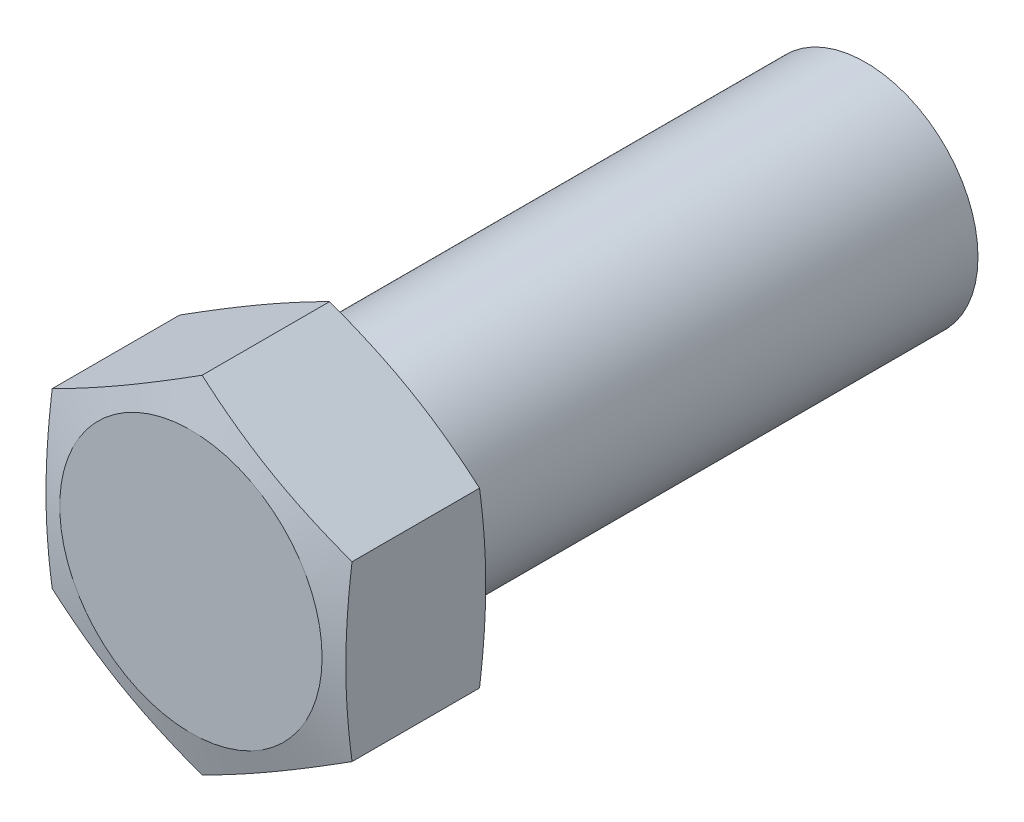
ISO-10303-21;
HEADER;
FILE_DESCRIPTION(('STEP AP214'),'2;1');
FILE_NAME('part.step','',(''),(''),'','','');
FILE_SCHEMA(('AUTOMOTIVE_DESIGN { 1 0 10303 214 1 1 1 1 }'));
ENDSEC;
DATA;
#1=APPLICATION_CONTEXT('core data for automotive mechanical design processes');
#2=APPLICATION_PROTOCOL_DEFINITION('international standard','automotive_design',2000,#1);
#3=PRODUCT_CONTEXT('',#1,'mechanical');
#4=PRODUCT('Part','Part','',(#3));
#5=PRODUCT_RELATED_PRODUCT_CATEGORY('part','',(#4));
#6=PRODUCT_DEFINITION_FORMATION('','',#4);
#7=PRODUCT_DEFINITION_CONTEXT('part definition',#1,'design');
#8=PRODUCT_DEFINITION('design','',#6,#7);
#9=PRODUCT_DEFINITION_SHAPE('','',#8);
#10=(LENGTH_UNIT() NAMED_UNIT(*) SI_UNIT(.MILLI.,.METRE.));
#11=(NAMED_UNIT(*) PLANE_ANGLE_UNIT() SI_UNIT($,.RADIAN.));
#12=(NAMED_UNIT(*) SI_UNIT($,.STERADIAN.) SOLID_ANGLE_UNIT());
#13=UNCERTAINTY_MEASURE_WITH_UNIT(LENGTH_MEASURE(1.E-05),#10,'distance_accuracy_value','');
#14=(GEOMETRIC_REPRESENTATION_CONTEXT(3) GLOBAL_UNCERTAINTY_ASSIGNED_CONTEXT((#13)) GLOBAL_UNIT_ASSIGNED_CONTEXT((#10,
#11,#12)) REPRESENTATION_CONTEXT('',''));
#15=CARTESIAN_POINT('',(0.,0.,0.));
#16=DIRECTION('',(0.,0.,1.));
#17=DIRECTION('',(1.,0.,0.));
#18=AXIS2_PLACEMENT_3D('',#15,#16,#17);
#19=CARTESIAN_POINT('',(-4.,-2.3094010767585,4.));
#20=DIRECTION('',(0.5,0.866025403784439,0.));
#21=DIRECTION('',(-0.866025403784439,0.5,0.));
#22=AXIS2_PLACEMENT_3D('',#19,#20,#21);
#23=PLANE('',#22);
#24=CARTESIAN_POINT('',(0.000199999999999127,-4.61891762357084,0.29981307479298));
#25=CARTESIAN_POINT('',(-0.165926511521663,-4.52300443742428,0.274101565956669));
#26=CARTESIAN_POINT('',(-0.332354243193628,-4.42691734174285,0.250759697684426));
#27=CARTESIAN_POINT('',(-0.665797498981121,-4.23440378825448,0.209750150499758));
#28=CARTESIAN_POINT('',(-0.832813234109738,-4.13797720861907,0.192084776673921));
#29=CARTESIAN_POINT('',(-1.16641980778899,-3.94536936350192,0.163459576980141));
#30=CARTESIAN_POINT('',(-1.33300839015655,-3.84918940062809,0.15246561202102));
#31=CARTESIAN_POINT('',(-1.66639801325971,-3.65670681198446,0.137723822723229));
#32=CARTESIAN_POINT('',(-1.83319900662985,-3.56040421356111,0.13397459621556));
#33=CARTESIAN_POINT('',(-2.16680099337015,-3.3677990167144,0.13397459621556));
#34=CARTESIAN_POINT('',(-2.33360198674029,-3.27149641829105,0.137723822723228));
#35=CARTESIAN_POINT('',(-2.66699160984345,-3.07901382964742,0.15246561202102));
#36=CARTESIAN_POINT('',(-2.83358019221101,-2.98283386677359,0.163459576980142));
#37=CARTESIAN_POINT('',(-3.16718676589026,-2.79022602165644,0.192084776673921));
#38=CARTESIAN_POINT('',(-3.33420250101888,-2.69379944202103,0.209750150499758));
#39=CARTESIAN_POINT('',(-3.66764575680637,-2.50128588853266,0.250759697684425));
#40=CARTESIAN_POINT('',(-3.83407348847834,-2.40519879285123,0.274101565956669));
#41=CARTESIAN_POINT('',(-4.0002,-2.30928560670467,0.29981307479298));
#42=B_SPLINE_CURVE_WITH_KNOTS('',3,(#24,#25,#26,#27,#28,#29,#30,#31,#32,#33,#34,#35,#36,#37,#38,
#39,#40,#41),.UNSPECIFIED.,.F.,.F.,(4,2,2,2,2,2,2,2,4),(0.,0.580655908162845,1.1615473094924,
1.73944052622642,2.31722188451988,2.89500324281333,3.47289645954735,4.0537878608769,
4.63444376903975),.UNSPECIFIED.);
#43=CARTESIAN_POINT('',(0.,-4.61880215351701,0.299782133525079));
#44=VERTEX_POINT('',#43);
#45=CARTESIAN_POINT('',(-4.,-2.3094010767585,0.299782133525079));
#46=VERTEX_POINT('',#45);
#47=EDGE_CURVE('E56',#44,#46,#42,.T.);
#48=ORIENTED_EDGE('',*,*,#47,.F.);
#49=DIRECTION('',(0.,0.,-1.));
#50=VECTOR('',#49,1.);
#51=CARTESIAN_POINT('',(0.,-4.61880215351701,4.));
#52=LINE('',#51,#50);
#53=CARTESIAN_POINT('',(0.,-4.61880215351701,3.70021786647492));
#54=VERTEX_POINT('',#53);
#55=EDGE_CURVE('E44',#54,#44,#52,.T.);
#56=ORIENTED_EDGE('',*,*,#55,.F.);
#57=CARTESIAN_POINT('',(-4.0002,-2.30928560670467,3.70018692520702));
#58=CARTESIAN_POINT('',(-3.83407348847834,-2.40519879285123,3.72589843404333));
#59=CARTESIAN_POINT('',(-3.66764575680637,-2.50128588853266,3.74924030231558));
#60=CARTESIAN_POINT('',(-3.33420250101888,-2.69379944202103,3.79024984950024));
#61=CARTESIAN_POINT('',(-3.16718676589026,-2.79022602165644,3.80791522332608));
#62=CARTESIAN_POINT('',(-2.83358019221101,-2.98283386677359,3.83654042301986));
#63=CARTESIAN_POINT('',(-2.66699160984345,-3.07901382964742,3.84753438797898));
#64=CARTESIAN_POINT('',(-2.33360198674029,-3.27149641829105,3.86227617727677));
#65=CARTESIAN_POINT('',(-2.16680099337015,-3.3677990167144,3.86602540378444));
#66=CARTESIAN_POINT('',(-1.83319900662985,-3.56040421356111,3.86602540378444));
#67=CARTESIAN_POINT('',(-1.66639801325971,-3.65670681198446,3.86227617727677));
#68=CARTESIAN_POINT('',(-1.33300839015655,-3.84918940062809,3.84753438797898));
#69=CARTESIAN_POINT('',(-1.16641980778899,-3.94536936350192,3.83654042301986));
#70=CARTESIAN_POINT('',(-0.832813234109738,-4.13797720861907,3.80791522332608));
#71=CARTESIAN_POINT('',(-0.665797498981122,-4.23440378825448,3.79024984950024));
#72=CARTESIAN_POINT('',(-0.332354243193629,-4.42691734174285,3.74924030231557));
#73=CARTESIAN_POINT('',(-0.165926511521664,-4.52300443742428,3.72589843404333));
#74=CARTESIAN_POINT('',(0.00019999999999848,-4.61891762357084,3.70018692520702));
#75=B_SPLINE_CURVE_WITH_KNOTS('',3,(#57,#58,#59,#60,#61,#62,#63,#64,#65,#66,#67,#68,#69,#70,#71,
#72,#73,#74),.UNSPECIFIED.,.F.,.F.,(4,2,2,2,2,2,2,2,4),(0.,0.580655908162845,1.1615473094924,
1.73944052622642,2.31722188451988,2.89500324281333,3.47289645954735,4.0537878608769,
4.63444376903975),.UNSPECIFIED.);
#76=CARTESIAN_POINT('',(-4.,-2.3094010767585,3.70021786647492));
#77=VERTEX_POINT('',#76);
#78=EDGE_CURVE('E117',#77,#54,#75,.T.);
#79=ORIENTED_EDGE('',*,*,#78,.F.);
#80=DIRECTION('',(0.,0.,-1.));
#81=VECTOR('',#80,1.);
#82=CARTESIAN_POINT('',(-4.,-2.3094010767585,4.));
#83=LINE('',#82,#81);
#84=EDGE_CURVE('E113',#77,#46,#83,.T.);
#85=ORIENTED_EDGE('',*,*,#84,.T.);
#86=EDGE_LOOP('',(#48,#56,#79,#85));
#87=FACE_BOUND('',#86,.T.);
#88=ADVANCED_FACE('F40',(#87),#23,.F.);
#89=CARTESIAN_POINT('',(0.,-4.61880215351701,4.));
#90=DIRECTION('',(-0.5,0.866025403784439,0.));
#91=DIRECTION('',(-0.866025403784439,-0.5,0.));
#92=AXIS2_PLACEMENT_3D('',#89,#90,#91);
#93=PLANE('',#92);
#94=CARTESIAN_POINT('',(4.0002,-2.30928560670467,0.29981307479298));
#95=CARTESIAN_POINT('',(3.83407348847834,-2.40519879285123,0.274101565956669));
#96=CARTESIAN_POINT('',(3.66764575680637,-2.50128588853266,0.250759697684426));
#97=CARTESIAN_POINT('',(3.33420250101888,-2.69379944202104,0.209750150499758));
#98=CARTESIAN_POINT('',(3.16718676589026,-2.79022602165644,0.192084776673922));
#99=CARTESIAN_POINT('',(2.83358019221101,-2.98283386677359,0.163459576980142));
#100=CARTESIAN_POINT('',(2.66699160984345,-3.07901382964742,0.15246561202102));
#101=CARTESIAN_POINT('',(2.33360198674029,-3.27149641829105,0.137723822723229));
#102=CARTESIAN_POINT('',(2.16680099337015,-3.3677990167144,0.13397459621556));
#103=CARTESIAN_POINT('',(1.83319900662985,-3.56040421356111,0.13397459621556));
#104=CARTESIAN_POINT('',(1.66639801325971,-3.65670681198446,0.137723822723229));
#105=CARTESIAN_POINT('',(1.33300839015655,-3.84918940062809,0.15246561202102));
#106=CARTESIAN_POINT('',(1.16641980778899,-3.94536936350192,0.163459576980141));
#107=CARTESIAN_POINT('',(0.832813234109737,-4.13797720861907,0.192084776673921));
#108=CARTESIAN_POINT('',(0.66579749898112,-4.23440378825448,0.209750150499758));
#109=CARTESIAN_POINT('',(0.332354243193627,-4.42691734174285,0.250759697684425));
#110=CARTESIAN_POINT('',(0.165926511521663,-4.52300443742428,0.274101565956669));
#111=CARTESIAN_POINT('',(-0.000200000000000079,-4.61891762357084,0.29981307479298));
#112=B_SPLINE_CURVE_WITH_KNOTS('',3,(#94,#95,#96,#97,#98,#99,#100,#101,#102,#103,#104,#105,#106,
#107,#108,#109,#110,#111),.UNSPECIFIED.,.F.,.F.,(4,2,2,2,2,2,2,2,4),(0.,0.580655908162846,
1.1615473094924,1.73944052622642,2.31722188451987,2.89500324281333,3.47289645954735,
4.0537878608769,4.63444376903975),.UNSPECIFIED.);
#113=CARTESIAN_POINT('',(4.,-2.30940107675851,0.299782133525078));
#114=VERTEX_POINT('',#113);
#115=EDGE_CURVE('E134',#114,#44,#112,.T.);
#116=ORIENTED_EDGE('',*,*,#115,.F.);
#117=DIRECTION('',(0.,0.,-1.));
#118=VECTOR('',#117,1.);
#119=CARTESIAN_POINT('',(4.,-2.30940107675851,4.));
#120=LINE('',#119,#118);
#121=CARTESIAN_POINT('',(4.,-2.30940107675851,3.70021786647492));
#122=VERTEX_POINT('',#121);
#123=EDGE_CURVE('E122',#122,#114,#120,.T.);
#124=ORIENTED_EDGE('',*,*,#123,.F.);
#125=CARTESIAN_POINT('',(-0.000200000000000944,-4.61891762357084,3.70018692520702));
#126=CARTESIAN_POINT('',(0.165926511521661,-4.52300443742428,3.72589843404333));
#127=CARTESIAN_POINT('',(0.332354243193626,-4.42691734174285,3.74924030231558));
#128=CARTESIAN_POINT('',(0.665797498981119,-4.23440378825448,3.79024984950024));
#129=CARTESIAN_POINT('',(0.832813234109736,-4.13797720861907,3.80791522332608));
#130=CARTESIAN_POINT('',(1.16641980778899,-3.94536936350192,3.83654042301986));
#131=CARTESIAN_POINT('',(1.33300839015655,-3.84918940062809,3.84753438797898));
#132=CARTESIAN_POINT('',(1.66639801325971,-3.65670681198446,3.86227617727677));
#133=CARTESIAN_POINT('',(1.83319900662985,-3.56040421356111,3.86602540378444));
#134=CARTESIAN_POINT('',(2.16680099337015,-3.36779901671441,3.86602540378444));
#135=CARTESIAN_POINT('',(2.33360198674029,-3.27149641829105,3.86227617727677));
#136=CARTESIAN_POINT('',(2.66699160984345,-3.07901382964742,3.84753438797898));
#137=CARTESIAN_POINT('',(2.83358019221101,-2.98283386677359,3.83654042301986));
#138=CARTESIAN_POINT('',(3.16718676589026,-2.79022602165645,3.80791522332608));
#139=CARTESIAN_POINT('',(3.33420250101888,-2.69379944202104,3.79024984950024));
#140=CARTESIAN_POINT('',(3.66764575680637,-2.50128588853266,3.74924030231558));
#141=CARTESIAN_POINT('',(3.83407348847834,-2.40519879285123,3.72589843404333));
#142=CARTESIAN_POINT('',(4.0002,-2.30928560670467,3.70018692520702));
#143=B_SPLINE_CURVE_WITH_KNOTS('',3,(#125,#126,#127,#128,#129,#130,#131,#132,#133,#134,#135,
#136,#137,#138,#139,#140,#141,#142),.UNSPECIFIED.,.F.,.F.,(4,2,2,2,2,2,2,2,4),(0.,
0.580655908162846,1.1615473094924,1.73944052622642,2.31722188451987,2.89500324281333,
3.47289645954735,4.0537878608769,4.63444376903975),.UNSPECIFIED.);
#144=EDGE_CURVE('E135',#54,#122,#143,.T.);
#145=ORIENTED_EDGE('',*,*,#144,.F.);
#146=ORIENTED_EDGE('',*,*,#55,.T.);
#147=EDGE_LOOP('',(#116,#124,#145,#146));
#148=FACE_BOUND('',#147,.T.);
#149=ADVANCED_FACE('F133',(#148),#93,.F.);
#150=CARTESIAN_POINT('',(4.,-2.30940107675851,4.));
#151=DIRECTION('',(-1.,0.,0.));
#152=DIRECTION('',(0.,-1.,0.));
#153=AXIS2_PLACEMENT_3D('',#150,#151,#152);
#154=PLANE('',#153);
#155=CARTESIAN_POINT('',(4.,-6.14417054673373,1.02664622445334));
#156=CARTESIAN_POINT('',(4.,-5.96217794516786,0.985789722236686));
#157=CARTESIAN_POINT('',(4.,-5.78007247672643,0.945427415059422));
#158=CARTESIAN_POINT('',(4.,-5.41558005681517,0.865958155069458));
#159=CARTESIAN_POINT('',(4.,-5.23319309372659,0.826851255609576));
#160=CARTESIAN_POINT('',(4.,-4.86792948159857,0.750128023113411));
#161=CARTESIAN_POINT('',(4.,-4.68505253646274,0.71251309406887));
#162=CARTESIAN_POINT('',(4.,-4.31892076944417,0.639173904320978));
#163=CARTESIAN_POINT('',(4.,-4.13566595071418,0.603449627908923));
#164=CARTESIAN_POINT('',(4.,-3.7704097042034,0.534661883593785));
#165=CARTESIAN_POINT('',(4.,-3.5884123810808,0.501576842305909));
#166=CARTESIAN_POINT('',(4.,-3.22392334685224,0.438259563502569));
#167=CARTESIAN_POINT('',(4.,-3.04143162449121,0.408027391504192));
#168=CARTESIAN_POINT('',(4.,-2.49314365523244,0.322596617941616));
#169=CARTESIAN_POINT('',(4.,-2.1264733291889,0.272651785396495));
#170=CARTESIAN_POINT('',(4.,-1.57266781427944,0.212938288960746));
#171=CARTESIAN_POINT('',(4.,-1.38635615971887,0.195512598470468));
#172=CARTESIAN_POINT('',(4.,-1.01325423095012,0.166790417150117));
#173=CARTESIAN_POINT('',(4.,-0.826463968034812,0.155493783017573));
#174=CARTESIAN_POINT('',(4.,-0.452690421172834,0.139684228901837));
#175=CARTESIAN_POINT('',(4.,-0.265707291554539,0.135167724384859));
#176=CARTESIAN_POINT('',(4.,0.108297032766911,0.133196380534602));
#177=CARTESIAN_POINT('',(4.,0.295318227442096,0.135741536030997));
#178=CARTESIAN_POINT('',(4.,0.670024110919452,0.147757369602756));
#179=CARTESIAN_POINT('',(4.,0.857707723265733,0.157260938416622));
#180=CARTESIAN_POINT('',(4.,1.23264423200582,0.182656577004498));
#181=CARTESIAN_POINT('',(4.,1.41989710439725,0.198548994511495));
#182=CARTESIAN_POINT('',(4.,1.79397315760716,0.235910414614248));
#183=CARTESIAN_POINT('',(4.,1.98079593226777,0.2573834217938));
#184=CARTESIAN_POINT('',(4.,2.35383616855648,0.305001212531216));
#185=CARTESIAN_POINT('',(4.,2.54005363380446,0.33114596809845));
#186=CARTESIAN_POINT('',(4.,2.96016504334748,0.394536743838916));
#187=CARTESIAN_POINT('',(4.,3.19388879763475,0.432902831570583));
#188=CARTESIAN_POINT('',(4.,3.6605343621564,0.514258036819141));
#189=CARTESIAN_POINT('',(4.,3.89345612303496,0.557247433792741));
#190=CARTESIAN_POINT('',(4.,4.35867364908035,0.646748498666232));
#191=CARTESIAN_POINT('',(4.,4.59096925628639,0.693260982339893));
#192=CARTESIAN_POINT('',(4.,5.05499926296683,0.788966434882229));
#193=CARTESIAN_POINT('',(4.,5.28673367481495,0.838159344078033));
#194=CARTESIAN_POINT('',(4.,5.74990161122598,0.938642784153472));
#195=CARTESIAN_POINT('',(4.,5.98133484682857,0.989934642375974));
#196=CARTESIAN_POINT('',(4.,6.44383778730721,1.09413456751387));
#197=CARTESIAN_POINT('',(4.,6.67490748973347,1.14704264527207));
#198=CARTESIAN_POINT('',(4.,7.36761169476598,1.30764524921582));
#199=CARTESIAN_POINT('',(4.,7.82880686150829,1.41723259409838));
#200=CARTESIAN_POINT('',(4.,8.74271333343547,1.63779052833902));
#201=CARTESIAN_POINT('',(4.,9.19543767998356,1.74870744274496));
#202=CARTESIAN_POINT('',(4.,10.1003716228128,1.97269737629437));
#203=CARTESIAN_POINT('',(4.,10.5525811973168,2.08577048330696));
#204=CARTESIAN_POINT('',(4.,11.4557301779659,2.31320793920331));
#205=CARTESIAN_POINT('',(4.,11.9066703343148,2.42756931558609));
#206=CARTESIAN_POINT('',(4.,12.8082391815779,2.65741712341779));
#207=CARTESIAN_POINT('',(4.,13.2588678873833,2.77290349642294));
#208=CARTESIAN_POINT('',(4.,13.7093988377106,2.88876639296815));
#209=B_SPLINE_CURVE_WITH_KNOTS('',3,(#155,#156,#157,#158,#159,#160,#161,#162,#163,#164,#165,
#166,#167,#168,#169,#170,#171,#172,#173,#174,#175,#176,#177,#178,#179,#180,#181,#182,#183,#184,
#185,#186,#187,#188,#189,#190,#191,#192,#193,#194,#195,#196,#197,#198,#199,#200,#201,#202,#203,
#204,#205,#206,#207,#208),.UNSPECIFIED.,.F.,.F.,(4,2,2,2,2,2,2,2,2,2,2,2,2,2,2,2,2,2,2,2,2,2,2,
2,2,2,4),(0.,0.559568920629866,1.11916159064555,1.67926893211698,2.23937161914164,
2.79428843635884,3.34921799432471,4.45888987923314,5.02018272743128,5.58146245156686,
6.14244533247455,6.70342780264827,7.26707916085542,7.83076120169763,8.3948488582551,
8.95893313521286,9.66942383587966,10.3799575064402,11.0906562076152,11.8013390933464,
12.5124785677062,13.2236228139629,14.6457099012489,16.0440447634996,17.4424367329579,
18.8380819821871,20.2336551100094),.UNSPECIFIED.);
#210=CARTESIAN_POINT('',(4.,2.3094010767585,0.299782133525079));
#211=VERTEX_POINT('',#210);
#212=EDGE_CURVE('E142',#211,#114,#209,.F.);
#213=ORIENTED_EDGE('',*,*,#212,.F.);
#214=DIRECTION('',(0.,0.,-1.));
#215=VECTOR('',#214,1.);
#216=CARTESIAN_POINT('',(4.,2.3094010767585,4.));
#217=LINE('',#216,#215);
#218=CARTESIAN_POINT('',(4.,2.3094010767585,3.70021786647492));
#219=VERTEX_POINT('',#218);
#220=EDGE_CURVE('E115',#219,#211,#217,.T.);
#221=ORIENTED_EDGE('',*,*,#220,.F.);
#222=CARTESIAN_POINT('',(4.,-6.14659284330347,2.97280980434322));
#223=CARTESIAN_POINT('',(4.,-5.96456959381723,3.01367798730566));
#224=CARTESIAN_POINT('',(4.,-5.78243352325518,3.05405222731707));
#225=CARTESIAN_POINT('',(4.,-5.41788000687482,3.13354598430963));
#226=CARTESIAN_POINT('',(4.,-5.23546254945688,3.17266544803337));
#227=CARTESIAN_POINT('',(4.,-4.87013856145989,3.24941447079918));
#228=CARTESIAN_POINT('',(4.,-4.68723173582449,3.28704263101602));
#229=CARTESIAN_POINT('',(4.,-4.32104031339256,3.3604092127098));
#230=CARTESIAN_POINT('',(4.,-4.13775571974332,3.39614764986499));
#231=CARTESIAN_POINT('',(4.,-3.77244510360189,3.4649637747083));
#232=CARTESIAN_POINT('',(4.,-3.59042319646012,3.49806308639547));
#233=CARTESIAN_POINT('',(4.,-3.22588506566355,3.56141028482897));
#234=CARTESIAN_POINT('',(4.,-3.04336883076058,3.59165810612078));
#235=CARTESIAN_POINT('',(4.,-2.49500660375781,3.67713832315656));
#236=CARTESIAN_POINT('',(4.,-2.12828656950945,3.72711930036011));
#237=CARTESIAN_POINT('',(4.,-1.57440409774898,3.78689121422639));
#238=CARTESIAN_POINT('',(4.,-1.3880656978966,3.80433723268491));
#239=CARTESIAN_POINT('',(4.,-1.01490970531134,3.83310053575118));
#240=CARTESIAN_POINT('',(4.,-0.828092123892198,3.84441796374414));
#241=CARTESIAN_POINT('',(4.,-0.454263764670304,3.86026841594604));
#242=CARTESIAN_POINT('',(4.,-0.267253142454284,3.8648050450865));
#243=CARTESIAN_POINT('',(4.,0.106806905686735,3.8668146924076));
#244=CARTESIAN_POINT('',(4.,0.293856331582194,3.86428771594611));
#245=CARTESIAN_POINT('',(4.,0.668624620284717,3.85230509486834));
#246=CARTESIAN_POINT('',(4.,0.856342402961526,3.84281635036628));
#247=CARTESIAN_POINT('',(4.,1.23134749647136,3.8174463524091));
#248=CARTESIAN_POINT('',(4.,1.4186347833145,3.80156475099285));
#249=CARTESIAN_POINT('',(4.,1.79278022825079,3.7642210027803));
#250=CARTESIAN_POINT('',(4.,1.97963797845618,3.74275483171796));
#251=CARTESIAN_POINT('',(4.,2.35274787343805,3.69514720851993));
#252=CARTESIAN_POINT('',(4.,2.53900002203128,3.66900578590797));
#253=CARTESIAN_POINT('',(4.,2.96106353657179,3.60533682666126));
#254=CARTESIAN_POINT('',(4.,3.1966972498774,3.56663972690722));
#255=CARTESIAN_POINT('',(4.,3.66715054193105,3.48455567141741));
#256=CARTESIAN_POINT('',(4.,3.90197006935002,3.44116842535409));
#257=CARTESIAN_POINT('',(4.,4.37097549458715,3.35082855448791));
#258=CARTESIAN_POINT('',(4.,4.60516122913221,3.30387508753987));
#259=CARTESIAN_POINT('',(4.,5.07296490126329,3.20726060317667));
#260=CARTESIAN_POINT('',(4.,5.30658285169419,3.15759964761951));
#261=CARTESIAN_POINT('',(4.,5.77351779828431,3.05616207577747));
#262=CARTESIAN_POINT('',(4.,6.00683449674114,3.0043840938605));
#263=CARTESIAN_POINT('',(4.,6.47310145463801,2.8992010783898));
#264=CARTESIAN_POINT('',(4.,6.70605171160338,2.84579603389727));
#265=CARTESIAN_POINT('',(4.,7.40439298930724,2.68369307659326));
#266=CARTESIAN_POINT('',(4.,7.86934185030623,2.57309248174759));
#267=CARTESIAN_POINT('',(4.,8.79058712797854,2.3505404460893));
#268=CARTESIAN_POINT('',(4.,9.2468968091345,2.2386435439793));
#269=CARTESIAN_POINT('',(4.,10.1590009728085,2.0126912853125));
#270=CARTESIAN_POINT('',(4.,10.6147954330525,1.89863583895518));
#271=CARTESIAN_POINT('',(4.,11.5250971270974,1.6692384127509));
#272=CARTESIAN_POINT('',(4.,11.9796051197032,1.55389943743097));
#273=CARTESIAN_POINT('',(4.,12.8883092407604,1.32209771609951));
#274=CARTESIAN_POINT('',(4.,13.3425053843107,1.20563502931327));
#275=CARTESIAN_POINT('',(4.,13.7966039802923,1.08879678408993));
#276=B_SPLINE_CURVE_WITH_KNOTS('',3,(#222,#223,#224,#225,#226,#227,#228,#229,#230,#231,#232,
#233,#234,#235,#236,#237,#238,#239,#240,#241,#242,#243,#244,#245,#246,#247,#248,#249,#250,#251,
#252,#253,#254,#255,#256,#257,#258,#259,#260,#261,#262,#263,#264,#265,#266,#267,#268,#269,#270,
#271,#272,#273,#274,#275),.UNSPECIFIED.,.F.,.F.,(4,2,2,2,2,2,2,2,2,2,2,2,2,2,2,2,2,2,2,2,2,2,2,
2,2,2,4),(0.,0.559666305052518,1.11935633309369,1.67955948489698,2.23975798819788,
2.7947550498903,3.34976484816189,4.45959952530008,5.02097797576993,5.58234329159642,
6.14341005790688,6.70447639863867,7.2682277722907,7.8320098348973,8.39619929215631,
8.96038518674172,9.67668931344408,10.3930378059353,11.1095559896447,11.8260578099135,
12.543029351224,13.2600057138304,14.6937515922727,16.1032331588528,17.5127734926476,
18.9195147917331,20.3261823490716),.UNSPECIFIED.);
#277=EDGE_CURVE('E202',#122,#219,#276,.T.);
#278=ORIENTED_EDGE('',*,*,#277,.F.);
#279=ORIENTED_EDGE('',*,*,#123,.T.);
#280=EDGE_LOOP('',(#213,#221,#278,#279));
#281=FACE_BOUND('',#280,.T.);
#282=ADVANCED_FACE('F194',(#281),#154,.F.);
#283=CARTESIAN_POINT('',(4.,2.3094010767585,4.));
#284=DIRECTION('',(-0.5,-0.866025403784439,0.));
#285=DIRECTION('',(0.866025403784439,-0.5,0.));
#286=AXIS2_PLACEMENT_3D('',#283,#284,#285);
#287=PLANE('',#286);
#288=CARTESIAN_POINT('',(-0.000200000000000403,4.61891762357085,0.29981307479298));
#289=CARTESIAN_POINT('',(0.165926511521662,4.52300443742428,0.274101565956669));
#290=CARTESIAN_POINT('',(0.332354243193626,4.42691734174285,0.250759697684426));
#291=CARTESIAN_POINT('',(0.665797498981119,4.23440378825448,0.209750150499758));
#292=CARTESIAN_POINT('',(0.832813234109736,4.13797720861907,0.192084776673922));
#293=CARTESIAN_POINT('',(1.16641980778899,3.94536936350192,0.163459576980142));
#294=CARTESIAN_POINT('',(1.33300839015655,3.84918940062809,0.15246561202102));
#295=CARTESIAN_POINT('',(1.6663980132597,3.65670681198446,0.137723822723228));
#296=CARTESIAN_POINT('',(1.83319900662985,3.56040421356111,0.13397459621556));
#297=CARTESIAN_POINT('',(2.16680099337014,3.36779901671441,0.13397459621556));
#298=CARTESIAN_POINT('',(2.33360198674029,3.27149641829105,0.137723822723229));
#299=CARTESIAN_POINT('',(2.66699160984345,3.07901382964742,0.15246561202102));
#300=CARTESIAN_POINT('',(2.83358019221101,2.98283386677359,0.163459576980141));
#301=CARTESIAN_POINT('',(3.16718676589026,2.79022602165644,0.192084776673921));
#302=CARTESIAN_POINT('',(3.33420250101888,2.69379944202103,0.209750150499758));
#303=CARTESIAN_POINT('',(3.66764575680637,2.50128588853266,0.250759697684425));
#304=CARTESIAN_POINT('',(3.83407348847833,2.40519879285123,0.274101565956669));
#305=CARTESIAN_POINT('',(4.0002,2.30928560670467,0.29981307479298));
#306=B_SPLINE_CURVE_WITH_KNOTS('',3,(#288,#289,#290,#291,#292,#293,#294,#295,#296,#297,#298,
#299,#300,#301,#302,#303,#304,#305),.UNSPECIFIED.,.F.,.F.,(4,2,2,2,2,2,2,2,4),(0.,
0.580655908162845,1.1615473094924,1.73944052622642,2.31722188451987,2.89500324281333,
3.47289645954735,4.0537878608769,4.63444376903975),.UNSPECIFIED.);
#307=CARTESIAN_POINT('',(0.,4.61880215351701,0.299782133525079));
#308=VERTEX_POINT('',#307);
#309=EDGE_CURVE('E109',#308,#211,#306,.T.);
#310=ORIENTED_EDGE('',*,*,#309,.F.);
#311=DIRECTION('',(0.,0.,-1.));
#312=VECTOR('',#311,1.);
#313=CARTESIAN_POINT('',(0.,4.61880215351701,4.));
#314=LINE('',#313,#312);
#315=CARTESIAN_POINT('',(0.,4.61880215351701,3.70021786647492));
#316=VERTEX_POINT('',#315);
#317=EDGE_CURVE('E108',#316,#308,#314,.T.);
#318=ORIENTED_EDGE('',*,*,#317,.F.);
#319=CARTESIAN_POINT('',(4.0002,2.30928560670467,3.70018692520702));
#320=CARTESIAN_POINT('',(3.83407348847834,2.40519879285123,3.72589843404333));
#321=CARTESIAN_POINT('',(3.66764575680637,2.50128588853266,3.74924030231558));
#322=CARTESIAN_POINT('',(3.33420250101888,2.69379944202103,3.79024984950024));
#323=CARTESIAN_POINT('',(3.16718676589026,2.79022602165644,3.80791522332608));
#324=CARTESIAN_POINT('',(2.83358019221101,2.98283386677359,3.83654042301986));
#325=CARTESIAN_POINT('',(2.66699160984345,3.07901382964742,3.84753438797898));
#326=CARTESIAN_POINT('',(2.33360198674029,3.27149641829105,3.86227617727677));
#327=CARTESIAN_POINT('',(2.16680099337015,3.3677990167144,3.86602540378444));
#328=CARTESIAN_POINT('',(1.83319900662985,3.56040421356111,3.86602540378444));
#329=CARTESIAN_POINT('',(1.66639801325971,3.65670681198446,3.86227617727677));
#330=CARTESIAN_POINT('',(1.33300839015655,3.84918940062809,3.84753438797898));
#331=CARTESIAN_POINT('',(1.16641980778899,3.94536936350192,3.83654042301986));
#332=CARTESIAN_POINT('',(0.832813234109736,4.13797720861907,3.80791522332608));
#333=CARTESIAN_POINT('',(0.665797498981119,4.23440378825448,3.79024984950024));
#334=CARTESIAN_POINT('',(0.332354243193626,4.42691734174285,3.74924030231557));
#335=CARTESIAN_POINT('',(0.165926511521661,4.52300443742428,3.72589843404333));
#336=CARTESIAN_POINT('',(-0.000200000000000915,4.61891762357085,3.70018692520702));
#337=B_SPLINE_CURVE_WITH_KNOTS('',3,(#319,#320,#321,#322,#323,#324,#325,#326,#327,#328,#329,
#330,#331,#332,#333,#334,#335,#336),.UNSPECIFIED.,.F.,.F.,(4,2,2,2,2,2,2,2,4),(0.,
0.580655908162845,1.1615473094924,1.73944052622642,2.31722188451988,2.89500324281333,
3.47289645954735,4.0537878608769,4.63444376903975),.UNSPECIFIED.);
#338=EDGE_CURVE('E209',#219,#316,#337,.T.);
#339=ORIENTED_EDGE('',*,*,#338,.F.);
#340=ORIENTED_EDGE('',*,*,#220,.T.);
#341=EDGE_LOOP('',(#310,#318,#339,#340));
#342=FACE_BOUND('',#341,.T.);
#343=ADVANCED_FACE('F197',(#342),#287,.F.);
#344=CARTESIAN_POINT('',(0.,4.61880215351701,4.));
#345=DIRECTION('',(0.5,-0.866025403784439,0.));
#346=DIRECTION('',(0.866025403784439,0.5,0.));
#347=AXIS2_PLACEMENT_3D('',#344,#345,#346);
#348=PLANE('',#347);
#349=CARTESIAN_POINT('',(-4.0002,2.30928560670467,0.29981307479298));
#350=CARTESIAN_POINT('',(-3.83407348847834,2.40519879285123,0.274101565956669));
#351=CARTESIAN_POINT('',(-3.66764575680637,2.50128588853266,0.250759697684426));
#352=CARTESIAN_POINT('',(-3.33420250101888,2.69379944202103,0.209750150499758));
#353=CARTESIAN_POINT('',(-3.16718676589026,2.79022602165644,0.192084776673922));
#354=CARTESIAN_POINT('',(-2.83358019221101,2.98283386677359,0.163459576980142));
#355=CARTESIAN_POINT('',(-2.66699160984345,3.07901382964742,0.15246561202102));
#356=CARTESIAN_POINT('',(-2.33360198674029,3.27149641829105,0.137723822723229));
#357=CARTESIAN_POINT('',(-2.16680099337015,3.36779901671441,0.13397459621556));
#358=CARTESIAN_POINT('',(-1.83319900662985,3.56040421356111,0.13397459621556));
#359=CARTESIAN_POINT('',(-1.66639801325971,3.65670681198446,0.137723822723229));
#360=CARTESIAN_POINT('',(-1.33300839015655,3.84918940062809,0.15246561202102));
#361=CARTESIAN_POINT('',(-1.16641980778899,3.94536936350192,0.163459576980142));
#362=CARTESIAN_POINT('',(-0.832813234109737,4.13797720861907,0.192084776673922));
#363=CARTESIAN_POINT('',(-0.66579749898112,4.23440378825448,0.209750150499758));
#364=CARTESIAN_POINT('',(-0.332354243193628,4.42691734174285,0.250759697684426));
#365=CARTESIAN_POINT('',(-0.165926511521663,4.52300443742428,0.27410156595667));
#366=CARTESIAN_POINT('',(0.000200000000000238,4.61891762357085,0.29981307479298));
#367=B_SPLINE_CURVE_WITH_KNOTS('',3,(#349,#350,#351,#352,#353,#354,#355,#356,#357,#358,#359,
#360,#361,#362,#363,#364,#365,#366),.UNSPECIFIED.,.F.,.F.,(4,2,2,2,2,2,2,2,4),(0.,
0.580655908162846,1.1615473094924,1.73944052622642,2.31722188451988,2.89500324281333,
3.47289645954735,4.0537878608769,4.63444376903975),.UNSPECIFIED.);
#368=CARTESIAN_POINT('',(-4.,2.3094010767585,0.299782133525079));
#369=VERTEX_POINT('',#368);
#370=EDGE_CURVE('E94',#369,#308,#367,.T.);
#371=ORIENTED_EDGE('',*,*,#370,.F.);
#372=DIRECTION('',(0.,0.,-1.));
#373=VECTOR('',#372,1.);
#374=CARTESIAN_POINT('',(-4.,2.3094010767585,4.));
#375=LINE('',#374,#373);
#376=CARTESIAN_POINT('',(-4.,2.3094010767585,3.70021786647492));
#377=VERTEX_POINT('',#376);
#378=EDGE_CURVE('E106',#377,#369,#375,.T.);
#379=ORIENTED_EDGE('',*,*,#378,.F.);
#380=CARTESIAN_POINT('',(0.000199999999999636,4.61891762357085,3.70018692520702));
#381=CARTESIAN_POINT('',(-0.165926511521663,4.52300443742428,3.72589843404333));
#382=CARTESIAN_POINT('',(-0.332354243193628,4.42691734174285,3.74924030231557));
#383=CARTESIAN_POINT('',(-0.665797498981121,4.23440378825448,3.79024984950024));
#384=CARTESIAN_POINT('',(-0.832813234109738,4.13797720861907,3.80791522332608));
#385=CARTESIAN_POINT('',(-1.16641980778899,3.94536936350192,3.83654042301986));
#386=CARTESIAN_POINT('',(-1.33300839015655,3.84918940062809,3.84753438797898));
#387=CARTESIAN_POINT('',(-1.66639801325971,3.65670681198446,3.86227617727677));
#388=CARTESIAN_POINT('',(-1.83319900662985,3.56040421356111,3.86602540378444));
#389=CARTESIAN_POINT('',(-2.16680099337015,3.36779901671441,3.86602540378444));
#390=CARTESIAN_POINT('',(-2.33360198674029,3.27149641829105,3.86227617727677));
#391=CARTESIAN_POINT('',(-2.66699160984345,3.07901382964742,3.84753438797898));
#392=CARTESIAN_POINT('',(-2.83358019221101,2.98283386677359,3.83654042301986));
#393=CARTESIAN_POINT('',(-3.16718676589026,2.79022602165644,3.80791522332608));
#394=CARTESIAN_POINT('',(-3.33420250101888,2.69379944202103,3.79024984950024));
#395=CARTESIAN_POINT('',(-3.66764575680637,2.50128588853266,3.74924030231557));
#396=CARTESIAN_POINT('',(-3.83407348847834,2.40519879285123,3.72589843404333));
#397=CARTESIAN_POINT('',(-4.0002,2.30928560670467,3.70018692520702));
#398=B_SPLINE_CURVE_WITH_KNOTS('',3,(#380,#381,#382,#383,#384,#385,#386,#387,#388,#389,#390,
#391,#392,#393,#394,#395,#396,#397),.UNSPECIFIED.,.F.,.F.,(4,2,2,2,2,2,2,2,4),(0.,
0.580655908162846,1.1615473094924,1.73944052622642,2.31722188451988,2.89500324281333,
3.47289645954735,4.05378786087691,4.63444376903975),.UNSPECIFIED.);
#399=EDGE_CURVE('E64',#316,#377,#398,.T.);
#400=ORIENTED_EDGE('',*,*,#399,.F.);
#401=ORIENTED_EDGE('',*,*,#317,.T.);
#402=EDGE_LOOP('',(#371,#379,#400,#401));
#403=FACE_BOUND('',#402,.T.);
#404=ADVANCED_FACE('F105',(#403),#348,.F.);
#405=CARTESIAN_POINT('',(-4.,2.3094010767585,4.));
#406=DIRECTION('',(1.,0.,0.));
#407=DIRECTION('',(0.,0.,-1.));
#408=AXIS2_PLACEMENT_3D('',#405,#406,#407);
#409=PLANE('',#408);
#410=CARTESIAN_POINT('',(-4.,-6.14417054670681,1.02664622444729));
#411=CARTESIAN_POINT('',(-4.,-5.96217794514203,0.985789722230938));
#412=CARTESIAN_POINT('',(-4.,-5.78007247670169,0.945427415053971));
#413=CARTESIAN_POINT('',(-4.,-5.41558005679261,0.865958155064596));
#414=CARTESIAN_POINT('',(-4.,-5.23319309370512,0.826851255605007));
#415=CARTESIAN_POINT('',(-4.,-4.86792948157928,0.750128023109421));
#416=CARTESIAN_POINT('',(-4.,-4.68505253644455,0.712513094065166));
#417=CARTESIAN_POINT('',(-4.,-4.31892076942818,0.639173904317837));
#418=CARTESIAN_POINT('',(-4.,-4.13566595069929,0.603449627906058));
#419=CARTESIAN_POINT('',(-4.,-3.77040970419068,0.53466188359145));
#420=CARTESIAN_POINT('',(-4.,-3.58841238106915,0.50157684230383));
#421=CARTESIAN_POINT('',(-4.,-3.22392334684274,0.438259563500977));
#422=CARTESIAN_POINT('',(-4.,-3.04143162448279,0.408027391502832));
#423=CARTESIAN_POINT('',(-4.,-2.49314365522725,0.322596617940906));
#424=CARTESIAN_POINT('',(-4.,-2.12647332918589,0.272651785396155));
#425=CARTESIAN_POINT('',(-4.,-1.57266781427983,0.212938288960796));
#426=CARTESIAN_POINT('',(-4.,-1.38635615972047,0.195512598470622));
#427=CARTESIAN_POINT('',(-4.,-1.01325423095415,0.166790417150396));
#428=CARTESIAN_POINT('',(-4.,-0.826463968040058,0.155493783017873));
#429=CARTESIAN_POINT('',(-4.,-0.452690421180516,0.139684228902084));
#430=CARTESIAN_POINT('',(-4.,-0.265707291563438,0.135167724385033));
#431=CARTESIAN_POINT('',(-4.,0.10829703275558,0.133196380534536));
#432=CARTESIAN_POINT('',(-4.,0.29531822742955,0.135741536030764));
#433=CARTESIAN_POINT('',(-4.,0.670024110904476,0.147757369602107));
#434=CARTESIAN_POINT('',(-4.,0.85770772324954,0.157260938415724));
#435=CARTESIAN_POINT('',(-4.,1.23264423198721,0.182656577003039));
#436=CARTESIAN_POINT('',(-4.,1.41989710437743,0.198548994509726));
#437=CARTESIAN_POINT('',(-4.,1.79397315758493,0.235910414611819));
#438=CARTESIAN_POINT('',(-4.,1.98079593224436,0.25738342179102));
#439=CARTESIAN_POINT('',(-4.,2.35383616853068,0.305001212527713));
#440=CARTESIAN_POINT('',(-4.,2.54005363377746,0.331145968094574));
#441=CARTESIAN_POINT('',(-4.,2.96016504331933,0.39453674383442));
#442=CARTESIAN_POINT('',(-4.,3.19388879760664,0.432902831565875));
#443=CARTESIAN_POINT('',(-4.,3.66053436212835,0.514258036814059));
#444=CARTESIAN_POINT('',(-4.,3.89345612300694,0.557247433787498));
#445=CARTESIAN_POINT('',(-4.,4.35867364905238,0.646748498660705));
#446=CARTESIAN_POINT('',(-4.,4.59096925625845,0.693260982334243));
#447=CARTESIAN_POINT('',(-4.,5.05499926293893,0.788966434876363));
#448=CARTESIAN_POINT('',(-4.,5.28673367478707,0.838159344072073));
#449=CARTESIAN_POINT('',(-4.,5.74990161119815,0.938642784147347));
#450=CARTESIAN_POINT('',(-4.,5.98133484680076,0.989934642369778));
#451=CARTESIAN_POINT('',(-4.,6.44383778727945,1.09413456750755));
#452=CARTESIAN_POINT('',(-4.,6.67490748970573,1.14704264526569));
#453=CARTESIAN_POINT('',(-4.,7.3676116947383,1.3076452492093));
#454=CARTESIAN_POINT('',(-4.,7.82880686148065,1.41723259409178));
#455=CARTESIAN_POINT('',(-4.,8.74271333340795,1.63779052833231));
#456=CARTESIAN_POINT('',(-4.,9.19543767995611,1.74870744273821));
#457=CARTESIAN_POINT('',(-4.,10.1003716227855,1.97269737628757));
#458=CARTESIAN_POINT('',(-4.,10.5525811972896,2.08577048330014));
#459=CARTESIAN_POINT('',(-4.,11.4557301779388,2.31320793919645));
#460=CARTESIAN_POINT('',(-4.,11.9066703342877,2.42756931557922));
#461=CARTESIAN_POINT('',(-4.,12.808239181551,2.6574171234109));
#462=CARTESIAN_POINT('',(-4.,13.2588678873564,2.77290349641604));
#463=CARTESIAN_POINT('',(-4.,13.7093988376837,2.88876639296123));
#464=B_SPLINE_CURVE_WITH_KNOTS('',3,(#410,#411,#412,#413,#414,#415,#416,#417,#418,#419,#420,
#421,#422,#423,#424,#425,#426,#427,#428,#429,#430,#431,#432,#433,#434,#435,#436,#437,#438,#439,
#440,#441,#442,#443,#444,#445,#446,#447,#448,#449,#450,#451,#452,#453,#454,#455,#456,#457,#458,
#459,#460,#461,#462,#463),.UNSPECIFIED.,.F.,.F.,(4,2,2,2,2,2,2,2,2,2,2,2,2,2,2,2,2,2,2,2,2,2,2,
2,2,2,4),(0.,0.559568920626482,1.11916159063878,1.67926893210681,2.23937161912808,
2.79428843634198,3.34921799430454,4.45888987920638,5.02018272740087,5.5814624515328,
6.14244533243684,6.70342780260692,7.26707916081038,7.83076120164892,8.3948488582027,
8.95893313515676,9.66942383582357,10.3799575063841,11.0906562075591,11.8013390932903,
12.5124785676501,13.2236228139068,14.645709901193,16.0440447634438,17.4424367329023,
18.8380819821317,20.233655109954),.UNSPECIFIED.);
#465=EDGE_CURVE('E91',#46,#369,#464,.T.);
#466=ORIENTED_EDGE('',*,*,#465,.F.);
#467=ORIENTED_EDGE('',*,*,#84,.F.);
#468=CARTESIAN_POINT('',(-4.,-6.14659284326863,2.97280980435105));
#469=CARTESIAN_POINT('',(-4.,-5.9645695937838,3.0136779873131));
#470=CARTESIAN_POINT('',(-4.,-5.78243352322317,3.05405222732413));
#471=CARTESIAN_POINT('',(-4.,-5.41788000684562,3.13354598431592));
#472=CARTESIAN_POINT('',(-4.,-5.2354625494291,3.17266544803928));
#473=CARTESIAN_POINT('',(-4.,-4.87013856143494,3.24941447080435));
#474=CARTESIAN_POINT('',(-4.,-4.68723173580096,3.28704263102082));
#475=CARTESIAN_POINT('',(-4.,-4.32104031337188,3.36040921271387));
#476=CARTESIAN_POINT('',(-4.,-4.13775571972406,3.39614764986869));
#477=CARTESIAN_POINT('',(-4.,-3.77244510358543,3.46496377471133));
#478=CARTESIAN_POINT('',(-4.,-3.59042319644505,3.49806308639816));
#479=CARTESIAN_POINT('',(-4.,-3.22588506565126,3.56141028483103));
#480=CARTESIAN_POINT('',(-4.,-3.04336883074969,3.59165810612254));
#481=CARTESIAN_POINT('',(-4.,-2.49500660375111,3.67713832315748));
#482=CARTESIAN_POINT('',(-4.,-2.12828656950556,3.72711930036055));
#483=CARTESIAN_POINT('',(-4.,-1.57440409774947,3.78689121422632));
#484=CARTESIAN_POINT('',(-4.,-1.38806569789867,3.80433723268471));
#485=CARTESIAN_POINT('',(-4.,-1.01490970531656,3.83310053575082));
#486=CARTESIAN_POINT('',(-4.,-0.828092123898987,3.84441796374375));
#487=CARTESIAN_POINT('',(-4.,-0.454263764680245,3.86026841594572));
#488=CARTESIAN_POINT('',(-4.,-0.267253142465802,3.86480504508628));
#489=CARTESIAN_POINT('',(-4.,0.106806905672071,3.86681469240769));
#490=CARTESIAN_POINT('',(-4.,0.293856331565959,3.86428771594641));
#491=CARTESIAN_POINT('',(-4.,0.668624620265338,3.85230509486918));
#492=CARTESIAN_POINT('',(-4.,0.856342402940573,3.84281635036744));
#493=CARTESIAN_POINT('',(-4.,1.23134749644728,3.81744635241098));
#494=CARTESIAN_POINT('',(-4.,1.41863478328886,3.80156475099514));
#495=CARTESIAN_POINT('',(-4.,1.79278022822203,3.76422100278344));
#496=CARTESIAN_POINT('',(-4.,1.97963797842588,3.74275483172156));
#497=CARTESIAN_POINT('',(-4.,2.35274787340466,3.69514720852446));
#498=CARTESIAN_POINT('',(-4.,2.53900002199634,3.66900578591298));
#499=CARTESIAN_POINT('',(-4.,2.96106353653537,3.60533682666708));
#500=CARTESIAN_POINT('',(-4.,3.19669724984102,3.56663972691332));
#501=CARTESIAN_POINT('',(-4.,3.66715054189475,3.484555671424));
#502=CARTESIAN_POINT('',(-4.,3.90197006931376,3.44116842536089));
#503=CARTESIAN_POINT('',(-4.,4.37097549455096,3.35082855449507));
#504=CARTESIAN_POINT('',(-4.,4.60516122909605,3.30387508754719));
#505=CARTESIAN_POINT('',(-4.,5.07296490122719,3.20726060318427));
#506=CARTESIAN_POINT('',(-4.,5.30658285165812,3.15759964762723));
#507=CARTESIAN_POINT('',(-4.,5.7735177982483,3.05616207578541));
#508=CARTESIAN_POINT('',(-4.,6.00683449670516,3.00438409386852));
#509=CARTESIAN_POINT('',(-4.,6.4731014546021,2.89920107839799));
#510=CARTESIAN_POINT('',(-4.,6.7060517115675,2.84579603390553));
#511=CARTESIAN_POINT('',(-4.,7.40439298927144,2.68369307660171));
#512=CARTESIAN_POINT('',(-4.,7.86934185027047,2.57309248175614));
#513=CARTESIAN_POINT('',(-4.,8.79058712794294,2.35054044609799));
#514=CARTESIAN_POINT('',(-4.,9.246896809099,2.23864354398803));
#515=CARTESIAN_POINT('',(-4.,10.1590009727732,2.0126912853213));
#516=CARTESIAN_POINT('',(-4.,10.6147954330173,1.898635838964));
#517=CARTESIAN_POINT('',(-4.,11.5250971270624,1.66923841275978));
#518=CARTESIAN_POINT('',(-4.,11.9796051196683,1.55389943743987));
#519=CARTESIAN_POINT('',(-4.,12.8883092407255,1.32209771610843));
#520=CARTESIAN_POINT('',(-4.,13.3425053842759,1.2056350293222));
#521=CARTESIAN_POINT('',(-4.,13.7966039802576,1.08879678409888));
#522=B_SPLINE_CURVE_WITH_KNOTS('',3,(#468,#469,#470,#471,#472,#473,#474,#475,#476,#477,#478,
#479,#480,#481,#482,#483,#484,#485,#486,#487,#488,#489,#490,#491,#492,#493,#494,#495,#496,#497,
#498,#499,#500,#501,#502,#503,#504,#505,#506,#507,#508,#509,#510,#511,#512,#513,#514,#515,#516,
#517,#518,#519,#520,#521),.UNSPECIFIED.,.F.,.F.,(4,2,2,2,2,2,2,2,2,2,2,2,2,2,2,2,2,2,2,2,2,2,2,
2,2,2,4),(0.,0.559666305048139,1.11935633308492,1.67955948488383,2.23975798818033,
2.79475504986848,3.3497648481358,4.45959952526545,5.02097797573057,5.58234329155235,
6.14341005785809,6.70447639858517,7.26822777223243,7.83200983483427,8.39619929208851,
8.96038518666914,9.67668931337149,10.3930378058627,11.1095559895721,11.826057809841,
12.5430293511515,13.2600057137579,14.6937515922003,16.1032331587806,17.5127734925757,
18.9195147916613,20.326182349),.UNSPECIFIED.);
#523=EDGE_CURVE('E112',#377,#77,#522,.F.);
#524=ORIENTED_EDGE('',*,*,#523,.F.);
#525=ORIENTED_EDGE('',*,*,#378,.T.);
#526=EDGE_LOOP('',(#466,#467,#524,#525));
#527=FACE_BOUND('',#526,.T.);
#528=ADVANCED_FACE('F111',(#527),#409,.F.);
#529=CARTESIAN_POINT('',(0.,0.,4.));
#530=DIRECTION('',(0.,0.,-1.));
#531=DIRECTION('',(1.,0.,0.));
#532=AXIS2_PLACEMENT_3D('',#529,#530,#531);
#533=CONICAL_SURFACE('',#532,3.5,1.30899693899575);
#534=CARTESIAN_POINT('',(0.,0.,4.));
#535=DIRECTION('',(0.,0.,1.));
#536=DIRECTION('',(1.,0.,0.));
#537=AXIS2_PLACEMENT_3D('',#534,#535,#536);
#538=CIRCLE('',#537,3.5);
#539=CARTESIAN_POINT('',(3.5,0.,4.));
#540=VERTEX_POINT('',#539);
#541=EDGE_CURVE('E138',#540,#540,#538,.T.);
#542=ORIENTED_EDGE('',*,*,#541,.F.);
#543=EDGE_LOOP('',(#542));
#544=FACE_BOUND('',#543,.T.);
#545=ORIENTED_EDGE('',*,*,#78,.T.);
#546=ORIENTED_EDGE('',*,*,#144,.T.);
#547=ORIENTED_EDGE('',*,*,#277,.T.);
#548=ORIENTED_EDGE('',*,*,#338,.T.);
#549=ORIENTED_EDGE('',*,*,#399,.T.);
#550=ORIENTED_EDGE('',*,*,#523,.T.);
#551=EDGE_LOOP('',(#545,#546,#547,#548,#549,#550));
#552=FACE_BOUND('',#551,.T.);
#553=ADVANCED_FACE('F164',(#544,#552),#533,.T.);
#554=CARTESIAN_POINT('',(0.,0.,4.));
#555=DIRECTION('',(0.,0.,1.));
#556=DIRECTION('',(1.,0.,0.));
#557=AXIS2_PLACEMENT_3D('',#554,#555,#556);
#558=PLANE('',#557);
#559=ORIENTED_EDGE('',*,*,#541,.T.);
#560=EDGE_LOOP('',(#559));
#561=FACE_BOUND('',#560,.T.);
#562=ADVANCED_FACE('F160',(#561),#558,.T.);
#563=CARTESIAN_POINT('',(0.,0.,0.));
#564=DIRECTION('',(0.,0.,1.));
#565=DIRECTION('',(-1.,0.,0.));
#566=AXIS2_PLACEMENT_3D('',#563,#564,#565);
#567=CONICAL_SURFACE('',#566,3.5,1.30899693899575);
#568=CARTESIAN_POINT('',(0.,0.,0.));
#569=DIRECTION('',(0.,0.,-1.));
#570=DIRECTION('',(-1.,0.,0.));
#571=AXIS2_PLACEMENT_3D('',#568,#569,#570);
#572=CIRCLE('',#571,3.5);
#573=CARTESIAN_POINT('',(-3.5,0.,0.));
#574=VERTEX_POINT('',#573);
#575=EDGE_CURVE('E100',#574,#574,#572,.T.);
#576=ORIENTED_EDGE('',*,*,#575,.F.);
#577=EDGE_LOOP('',(#576));
#578=FACE_BOUND('',#577,.T.);
#579=ORIENTED_EDGE('',*,*,#47,.T.);
#580=ORIENTED_EDGE('',*,*,#465,.T.);
#581=ORIENTED_EDGE('',*,*,#370,.T.);
#582=ORIENTED_EDGE('',*,*,#309,.T.);
#583=ORIENTED_EDGE('',*,*,#212,.T.);
#584=ORIENTED_EDGE('',*,*,#115,.T.);
#585=EDGE_LOOP('',(#579,#580,#581,#582,#583,#584));
#586=FACE_BOUND('',#585,.T.);
#587=ADVANCED_FACE('F93',(#578,#586),#567,.T.);
#588=CARTESIAN_POINT('',(0.,0.,0.));
#589=DIRECTION('',(0.,0.,1.));
#590=DIRECTION('',(1.,0.,0.));
#591=AXIS2_PLACEMENT_3D('',#588,#589,#590);
#592=PLANE('',#591);
#593=CARTESIAN_POINT('',(0.,0.,0.));
#594=DIRECTION('',(0.,0.,-1.));
#595=DIRECTION('',(-1.,0.,0.));
#596=AXIS2_PLACEMENT_3D('',#593,#594,#595);
#597=CIRCLE('',#596,3.);
#598=CARTESIAN_POINT('',(-3.,0.,0.));
#599=VERTEX_POINT('',#598);
#600=EDGE_CURVE('E12',#599,#599,#597,.T.);
#601=ORIENTED_EDGE('',*,*,#600,.F.);
#602=EDGE_LOOP('',(#601));
#603=FACE_BOUND('',#602,.T.);
#604=ORIENTED_EDGE('',*,*,#575,.T.);
#605=EDGE_LOOP('',(#604));
#606=FACE_BOUND('',#605,.T.);
#607=ADVANCED_FACE('F159',(#603,#606),#592,.F.);
#608=CARTESIAN_POINT('',(0.,0.,-14.));
#609=DIRECTION('',(0.,0.,1.));
#610=DIRECTION('',(1.,0.,0.));
#611=AXIS2_PLACEMENT_3D('',#608,#609,#610);
#612=CYLINDRICAL_SURFACE('',#611,3.);
#613=CARTESIAN_POINT('',(0.,0.,-14.));
#614=DIRECTION('',(0.,0.,-1.));
#615=DIRECTION('',(-1.,0.,0.));
#616=AXIS2_PLACEMENT_3D('',#613,#614,#615);
#617=CIRCLE('',#616,3.);
#618=CARTESIAN_POINT('',(-3.,0.,-14.));
#619=VERTEX_POINT('',#618);
#620=EDGE_CURVE('E309',#619,#619,#617,.T.);
#621=ORIENTED_EDGE('',*,*,#620,.F.);
#622=EDGE_LOOP('',(#621));
#623=FACE_BOUND('',#622,.T.);
#624=ORIENTED_EDGE('',*,*,#600,.T.);
#625=EDGE_LOOP('',(#624));
#626=FACE_BOUND('',#625,.T.);
#627=ADVANCED_FACE('F162',(#623,#626),#612,.T.);
#628=CARTESIAN_POINT('',(0.,0.,-14.));
#629=DIRECTION('',(0.,0.,-1.));
#630=DIRECTION('',(-1.,0.,0.));
#631=AXIS2_PLACEMENT_3D('',#628,#629,#630);
#632=PLANE('',#631);
#633=ORIENTED_EDGE('',*,*,#620,.T.);
#634=EDGE_LOOP('',(#633));
#635=FACE_BOUND('',#634,.T.);
#636=ADVANCED_FACE('F294',(#635),#632,.T.);
#637=CLOSED_SHELL('',(#88,#149,#282,#343,#404,#528,#553,#562,#587,#607,#627,#636));
#638=MANIFOLD_SOLID_BREP('B2',#637);
#639=ADVANCED_BREP_SHAPE_REPRESENTATION('',(#18,#638),#14);
#640=SHAPE_DEFINITION_REPRESENTATION(#9,#639);
ENDSEC;
END-ISO-10303-21;
